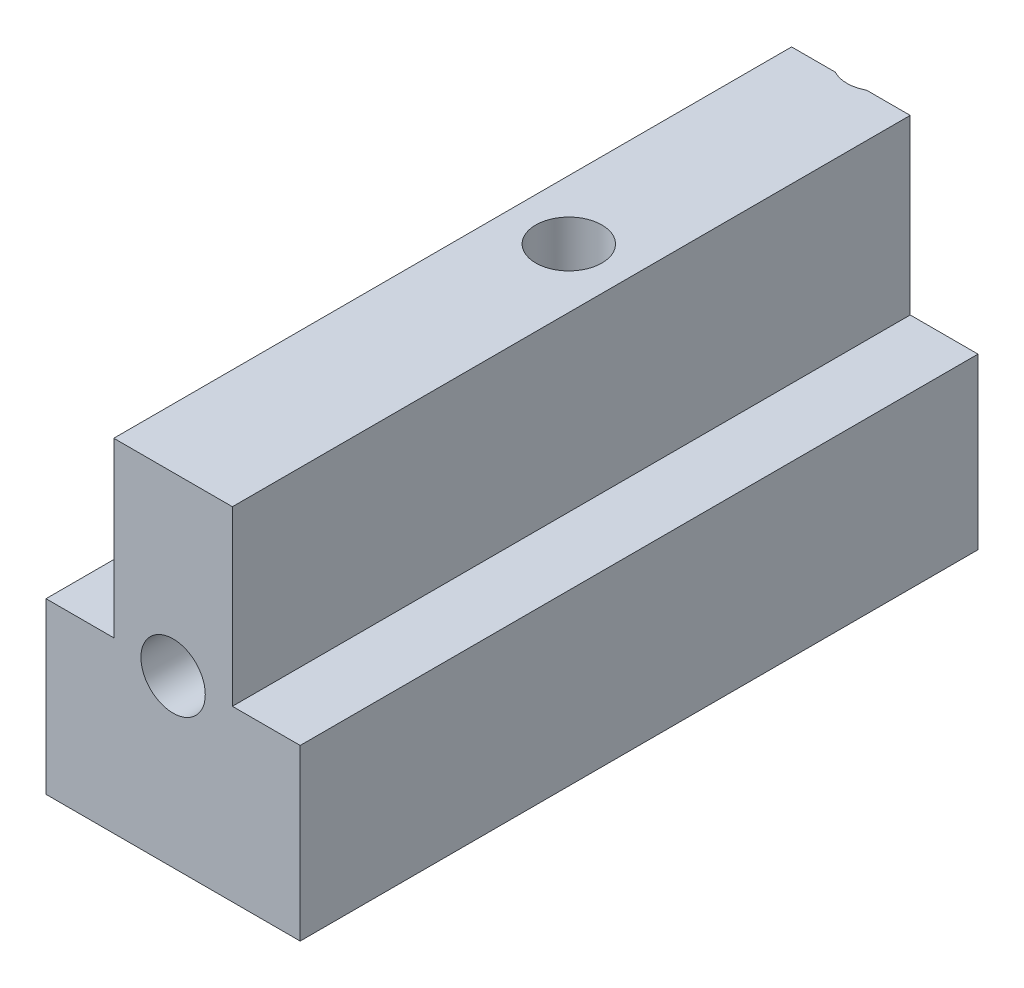
ISO-10303-21;
HEADER;
FILE_DESCRIPTION(('STEP AP214'),'2;1');
FILE_NAME('part.step','',(''),(''),'','','');
FILE_SCHEMA(('AUTOMOTIVE_DESIGN { 1 0 10303 214 1 1 1 1 }'));
ENDSEC;
DATA;
#1=APPLICATION_CONTEXT('core data for automotive mechanical design processes');
#2=APPLICATION_PROTOCOL_DEFINITION('international standard','automotive_design',2000,#1);
#3=PRODUCT_CONTEXT('',#1,'mechanical');
#4=PRODUCT('Part','Part','',(#3));
#5=PRODUCT_RELATED_PRODUCT_CATEGORY('part','',(#4));
#6=PRODUCT_DEFINITION_FORMATION('','',#4);
#7=PRODUCT_DEFINITION_CONTEXT('part definition',#1,'design');
#8=PRODUCT_DEFINITION('design','',#6,#7);
#9=PRODUCT_DEFINITION_SHAPE('','',#8);
#10=(LENGTH_UNIT() NAMED_UNIT(*) SI_UNIT(.MILLI.,.METRE.));
#11=(NAMED_UNIT(*) PLANE_ANGLE_UNIT() SI_UNIT($,.RADIAN.));
#12=(NAMED_UNIT(*) SI_UNIT($,.STERADIAN.) SOLID_ANGLE_UNIT());
#13=UNCERTAINTY_MEASURE_WITH_UNIT(LENGTH_MEASURE(1.E-05),#10,'distance_accuracy_value','');
#14=(GEOMETRIC_REPRESENTATION_CONTEXT(3) GLOBAL_UNCERTAINTY_ASSIGNED_CONTEXT((#13)) GLOBAL_UNIT_ASSIGNED_CONTEXT((#10,
#11,#12)) REPRESENTATION_CONTEXT('',''));
#15=CARTESIAN_POINT('',(0.,0.,0.));
#16=DIRECTION('',(0.,0.,1.));
#17=DIRECTION('',(1.,0.,0.));
#18=AXIS2_PLACEMENT_3D('',#15,#16,#17);
#19=CARTESIAN_POINT('',(0.,0.,0.));
#20=DIRECTION('',(0.,0.,-1.));
#21=DIRECTION('',(-1.,0.,0.));
#22=AXIS2_PLACEMENT_3D('',#19,#20,#21);
#23=PLANE('',#22);
#24=DIRECTION('',(0.,1.,0.));
#25=VECTOR('',#24,1.);
#26=CARTESIAN_POINT('',(0.210564790841906,-7.65729166666666,0.));
#27=LINE('',#26,#25);
#28=CARTESIAN_POINT('',(0.210564790841906,-7.65729166666666,0.));
#29=VERTEX_POINT('',#28);
#30=CARTESIAN_POINT('',(0.210564790841906,2.44270833333333,0.));
#31=VERTEX_POINT('',#30);
#32=EDGE_CURVE('E11',#29,#31,#27,.T.);
#33=ORIENTED_EDGE('',*,*,#32,.F.);
#34=DIRECTION('',(1.,0.,0.));
#35=VECTOR('',#34,1.);
#36=CARTESIAN_POINT('',(4.41993936567164,-7.65729166666666,0.));
#37=LINE('',#36,#35);
#38=CARTESIAN_POINT('',(-3.08006063432836,-7.65729166666666,0.));
#39=VERTEX_POINT('',#38);
#40=EDGE_CURVE('E150',#39,#29,#37,.T.);
#41=ORIENTED_EDGE('',*,*,#40,.F.);
#42=DIRECTION('',(0.,-1.,0.));
#43=VECTOR('',#42,1.);
#44=CARTESIAN_POINT('',(-3.08006063432836,-7.65729166666666,0.));
#45=LINE('',#44,#43);
#46=CARTESIAN_POINT('',(-3.08006063432836,-2.65729166666666,0.));
#47=VERTEX_POINT('',#46);
#48=EDGE_CURVE('E147',#47,#39,#45,.T.);
#49=ORIENTED_EDGE('',*,*,#48,.F.);
#50=DIRECTION('',(-1.,0.,0.));
#51=VECTOR('',#50,1.);
#52=CARTESIAN_POINT('',(-3.08006063432836,-2.65729166666666,0.));
#53=LINE('',#52,#51);
#54=CARTESIAN_POINT('',(-1.08006063432836,-2.65729166666666,0.));
#55=VERTEX_POINT('',#54);
#56=EDGE_CURVE('E144',#55,#47,#53,.T.);
#57=ORIENTED_EDGE('',*,*,#56,.F.);
#58=DIRECTION('',(0.,-1.,0.));
#59=VECTOR('',#58,1.);
#60=CARTESIAN_POINT('',(-1.08006063432836,-2.65729166666666,0.));
#61=LINE('',#60,#59);
#62=CARTESIAN_POINT('',(-1.08006063432836,2.44270833333333,0.));
#63=VERTEX_POINT('',#62);
#64=EDGE_CURVE('E141',#63,#55,#61,.T.);
#65=ORIENTED_EDGE('',*,*,#64,.F.);
#66=DIRECTION('',(-1.,0.,0.));
#67=VECTOR('',#66,1.);
#68=CARTESIAN_POINT('',(-1.08006063432836,2.44270833333333,0.));
#69=LINE('',#68,#67);
#70=EDGE_CURVE('E88',#31,#63,#69,.T.);
#71=ORIENTED_EDGE('',*,*,#70,.F.);
#72=EDGE_LOOP('',(#33,#41,#49,#57,#65,#71));
#73=FACE_BOUND('',#72,.T.);
#74=ADVANCED_FACE('F32',(#73),#23,.T.);
#75=CARTESIAN_POINT('',(-1.08006063432836,-2.65729166666666,20.));
#76=DIRECTION('',(1.,0.,0.));
#77=DIRECTION('',(0.,0.,-1.));
#78=AXIS2_PLACEMENT_3D('',#75,#76,#77);
#79=PLANE('',#78);
#80=ORIENTED_EDGE('',*,*,#64,.T.);
#81=DIRECTION('',(0.,0.,-1.));
#82=VECTOR('',#81,1.);
#83=CARTESIAN_POINT('',(-1.08006063432836,-2.65729166666666,20.));
#84=LINE('',#83,#82);
#85=CARTESIAN_POINT('',(-1.08006063432836,-2.65729166666666,20.));
#86=VERTEX_POINT('',#85);
#87=EDGE_CURVE('E174',#86,#55,#84,.T.);
#88=ORIENTED_EDGE('',*,*,#87,.F.);
#89=DIRECTION('',(0.,-1.,0.));
#90=VECTOR('',#89,1.);
#91=CARTESIAN_POINT('',(-1.08006063432836,-2.65729166666666,20.));
#92=LINE('',#91,#90);
#93=CARTESIAN_POINT('',(-1.08006063432836,2.44270833333333,20.));
#94=VERTEX_POINT('',#93);
#95=EDGE_CURVE('E161',#94,#86,#92,.T.);
#96=ORIENTED_EDGE('',*,*,#95,.F.);
#97=DIRECTION('',(0.,0.,-1.));
#98=VECTOR('',#97,1.);
#99=CARTESIAN_POINT('',(-1.08006063432836,2.44270833333333,20.));
#100=LINE('',#99,#98);
#101=EDGE_CURVE('E137',#94,#63,#100,.T.);
#102=ORIENTED_EDGE('',*,*,#101,.T.);
#103=EDGE_LOOP('',(#80,#88,#96,#102));
#104=FACE_BOUND('',#103,.T.);
#105=ADVANCED_FACE('F34',(#104),#79,.F.);
#106=CARTESIAN_POINT('',(-3.08006063432836,-2.65729166666666,20.));
#107=DIRECTION('',(0.,-1.,0.));
#108=DIRECTION('',(0.,0.,-1.));
#109=AXIS2_PLACEMENT_3D('',#106,#107,#108);
#110=PLANE('',#109);
#111=ORIENTED_EDGE('',*,*,#56,.T.);
#112=DIRECTION('',(0.,0.,-1.));
#113=VECTOR('',#112,1.);
#114=CARTESIAN_POINT('',(-3.08006063432836,-2.65729166666666,20.));
#115=LINE('',#114,#113);
#116=CARTESIAN_POINT('',(-3.08006063432836,-2.65729166666666,20.));
#117=VERTEX_POINT('',#116);
#118=EDGE_CURVE('E171',#117,#47,#115,.T.);
#119=ORIENTED_EDGE('',*,*,#118,.F.);
#120=DIRECTION('',(-1.,0.,0.));
#121=VECTOR('',#120,1.);
#122=CARTESIAN_POINT('',(-3.08006063432836,-2.65729166666666,20.));
#123=LINE('',#122,#121);
#124=EDGE_CURVE('E97',#86,#117,#123,.T.);
#125=ORIENTED_EDGE('',*,*,#124,.F.);
#126=ORIENTED_EDGE('',*,*,#87,.T.);
#127=EDGE_LOOP('',(#111,#119,#125,#126));
#128=FACE_BOUND('',#127,.T.);
#129=ADVANCED_FACE('F231',(#128),#110,.F.);
#130=CARTESIAN_POINT('',(-3.08006063432836,-7.65729166666666,20.));
#131=DIRECTION('',(1.,0.,0.));
#132=DIRECTION('',(0.,0.,-1.));
#133=AXIS2_PLACEMENT_3D('',#130,#131,#132);
#134=PLANE('',#133);
#135=ORIENTED_EDGE('',*,*,#48,.T.);
#136=DIRECTION('',(0.,0.,-1.));
#137=VECTOR('',#136,1.);
#138=CARTESIAN_POINT('',(-3.08006063432836,-7.65729166666666,20.));
#139=LINE('',#138,#137);
#140=CARTESIAN_POINT('',(-3.08006063432836,-7.65729166666666,20.));
#141=VERTEX_POINT('',#140);
#142=EDGE_CURVE('E168',#141,#39,#139,.T.);
#143=ORIENTED_EDGE('',*,*,#142,.F.);
#144=DIRECTION('',(0.,-1.,0.));
#145=VECTOR('',#144,1.);
#146=CARTESIAN_POINT('',(-3.08006063432836,-7.65729166666666,20.));
#147=LINE('',#146,#145);
#148=EDGE_CURVE('E200',#117,#141,#147,.T.);
#149=ORIENTED_EDGE('',*,*,#148,.F.);
#150=ORIENTED_EDGE('',*,*,#118,.T.);
#151=EDGE_LOOP('',(#135,#143,#149,#150));
#152=FACE_BOUND('',#151,.T.);
#153=ADVANCED_FACE('F234',(#152),#134,.F.);
#154=CARTESIAN_POINT('',(4.41993936567164,-7.65729166666666,20.));
#155=DIRECTION('',(0.,1.,0.));
#156=DIRECTION('',(-1.,0.,0.));
#157=AXIS2_PLACEMENT_3D('',#154,#155,#156);
#158=PLANE('',#157);
#159=CARTESIAN_POINT('',(0.66993936567164,-7.65729166666666,8.32292777632495));
#160=DIRECTION('',(0.,1.,0.));
#161=DIRECTION('',(0.,0.,1.));
#162=AXIS2_PLACEMENT_3D('',#159,#160,#161);
#163=CIRCLE('',#162,0.975);
#164=CARTESIAN_POINT('',(0.66993936567164,-7.65729166666666,9.29792777632495));
#165=VERTEX_POINT('',#164);
#166=EDGE_CURVE('E191',#165,#165,#163,.T.);
#167=ORIENTED_EDGE('',*,*,#166,.T.);
#168=EDGE_LOOP('',(#167));
#169=FACE_BOUND('',#168,.T.);
#170=ORIENTED_EDGE('',*,*,#40,.T.);
#171=CARTESIAN_POINT('',(0.669939365671643,-7.65729166666666,-0.859999999999999));
#172=DIRECTION('',(0.,1.,0.));
#173=DIRECTION('',(0.,0.,1.));
#174=AXIS2_PLACEMENT_3D('',#171,#172,#173);
#175=CIRCLE('',#174,0.975000000000001);
#176=CARTESIAN_POINT('',(1.12931394050138,-7.65729166666666,0.));
#177=VERTEX_POINT('',#176);
#178=EDGE_CURVE('E181',#29,#177,#175,.T.);
#179=ORIENTED_EDGE('',*,*,#178,.T.);
#180=CARTESIAN_POINT('',(4.41993936567164,-7.65729166666666,0.));
#181=VERTEX_POINT('',#180);
#182=EDGE_CURVE('E149',#177,#181,#37,.T.);
#183=ORIENTED_EDGE('',*,*,#182,.T.);
#184=DIRECTION('',(0.,0.,-1.));
#185=VECTOR('',#184,1.);
#186=CARTESIAN_POINT('',(4.41993936567164,-7.65729166666666,20.));
#187=LINE('',#186,#185);
#188=CARTESIAN_POINT('',(4.41993936567164,-7.65729166666666,20.));
#189=VERTEX_POINT('',#188);
#190=EDGE_CURVE('E165',#189,#181,#187,.T.);
#191=ORIENTED_EDGE('',*,*,#190,.F.);
#192=DIRECTION('',(1.,0.,0.));
#193=VECTOR('',#192,1.);
#194=CARTESIAN_POINT('',(4.41993936567164,-7.65729166666666,20.));
#195=LINE('',#194,#193);
#196=EDGE_CURVE('E198',#141,#189,#195,.T.);
#197=ORIENTED_EDGE('',*,*,#196,.F.);
#198=ORIENTED_EDGE('',*,*,#142,.T.);
#199=EDGE_LOOP('',(#170,#179,#183,#191,#197,#198));
#200=FACE_BOUND('',#199,.T.);
#201=ADVANCED_FACE('F188',(#169,#200),#158,.F.);
#202=CARTESIAN_POINT('',(4.41993936567164,-2.65729166666666,20.));
#203=DIRECTION('',(-1.,0.,0.));
#204=DIRECTION('',(0.,0.,1.));
#205=AXIS2_PLACEMENT_3D('',#202,#203,#204);
#206=PLANE('',#205);
#207=DIRECTION('',(0.,1.,0.));
#208=VECTOR('',#207,1.);
#209=CARTESIAN_POINT('',(4.41993936567164,-2.65729166666666,0.));
#210=LINE('',#209,#208);
#211=CARTESIAN_POINT('',(4.41993936567164,-2.65729166666666,0.));
#212=VERTEX_POINT('',#211);
#213=EDGE_CURVE('E153',#181,#212,#210,.T.);
#214=ORIENTED_EDGE('',*,*,#213,.T.);
#215=DIRECTION('',(0.,0.,-1.));
#216=VECTOR('',#215,1.);
#217=CARTESIAN_POINT('',(4.41993936567164,-2.65729166666666,20.));
#218=LINE('',#217,#216);
#219=CARTESIAN_POINT('',(4.41993936567164,-2.65729166666666,20.));
#220=VERTEX_POINT('',#219);
#221=EDGE_CURVE('E131',#220,#212,#218,.T.);
#222=ORIENTED_EDGE('',*,*,#221,.F.);
#223=DIRECTION('',(0.,1.,0.));
#224=VECTOR('',#223,1.);
#225=CARTESIAN_POINT('',(4.41993936567164,-2.65729166666666,20.));
#226=LINE('',#225,#224);
#227=EDGE_CURVE('E119',#189,#220,#226,.T.);
#228=ORIENTED_EDGE('',*,*,#227,.F.);
#229=ORIENTED_EDGE('',*,*,#190,.T.);
#230=EDGE_LOOP('',(#214,#222,#228,#229));
#231=FACE_BOUND('',#230,.T.);
#232=ADVANCED_FACE('F196',(#231),#206,.F.);
#233=CARTESIAN_POINT('',(2.41993936567164,-2.65729166666666,20.));
#234=DIRECTION('',(0.,-1.,0.));
#235=DIRECTION('',(0.,0.,-1.));
#236=AXIS2_PLACEMENT_3D('',#233,#234,#235);
#237=PLANE('',#236);
#238=DIRECTION('',(-1.,0.,0.));
#239=VECTOR('',#238,1.);
#240=CARTESIAN_POINT('',(2.41993936567164,-2.65729166666666,0.));
#241=LINE('',#240,#239);
#242=CARTESIAN_POINT('',(2.41993936567164,-2.65729166666666,0.));
#243=VERTEX_POINT('',#242);
#244=EDGE_CURVE('E128',#212,#243,#241,.T.);
#245=ORIENTED_EDGE('',*,*,#244,.T.);
#246=DIRECTION('',(0.,0.,-1.));
#247=VECTOR('',#246,1.);
#248=CARTESIAN_POINT('',(2.41993936567164,-2.65729166666666,20.));
#249=LINE('',#248,#247);
#250=CARTESIAN_POINT('',(2.41993936567164,-2.65729166666666,20.));
#251=VERTEX_POINT('',#250);
#252=EDGE_CURVE('E125',#251,#243,#249,.T.);
#253=ORIENTED_EDGE('',*,*,#252,.F.);
#254=DIRECTION('',(-1.,0.,0.));
#255=VECTOR('',#254,1.);
#256=CARTESIAN_POINT('',(2.41993936567164,-2.65729166666666,20.));
#257=LINE('',#256,#255);
#258=EDGE_CURVE('E112',#220,#251,#257,.T.);
#259=ORIENTED_EDGE('',*,*,#258,.F.);
#260=ORIENTED_EDGE('',*,*,#221,.T.);
#261=EDGE_LOOP('',(#245,#253,#259,#260));
#262=FACE_BOUND('',#261,.T.);
#263=ADVANCED_FACE('F126',(#262),#237,.F.);
#264=CARTESIAN_POINT('',(2.41993936567164,2.44270833333333,20.));
#265=DIRECTION('',(-1.,0.,0.));
#266=DIRECTION('',(0.,-1.,0.));
#267=AXIS2_PLACEMENT_3D('',#264,#265,#266);
#268=PLANE('',#267);
#269=DIRECTION('',(0.,1.,0.));
#270=VECTOR('',#269,1.);
#271=CARTESIAN_POINT('',(2.41993936567164,2.44270833333333,0.));
#272=LINE('',#271,#270);
#273=CARTESIAN_POINT('',(2.41993936567164,2.44270833333333,0.));
#274=VERTEX_POINT('',#273);
#275=EDGE_CURVE('E156',#243,#274,#272,.T.);
#276=ORIENTED_EDGE('',*,*,#275,.T.);
#277=DIRECTION('',(0.,0.,-1.));
#278=VECTOR('',#277,1.);
#279=CARTESIAN_POINT('',(2.41993936567164,2.44270833333333,20.));
#280=LINE('',#279,#278);
#281=CARTESIAN_POINT('',(2.41993936567164,2.44270833333333,20.));
#282=VERTEX_POINT('',#281);
#283=EDGE_CURVE('E132',#282,#274,#280,.T.);
#284=ORIENTED_EDGE('',*,*,#283,.F.);
#285=DIRECTION('',(0.,1.,0.));
#286=VECTOR('',#285,1.);
#287=CARTESIAN_POINT('',(2.41993936567164,2.44270833333333,20.));
#288=LINE('',#287,#286);
#289=EDGE_CURVE('E116',#251,#282,#288,.T.);
#290=ORIENTED_EDGE('',*,*,#289,.F.);
#291=ORIENTED_EDGE('',*,*,#252,.T.);
#292=EDGE_LOOP('',(#276,#284,#290,#291));
#293=FACE_BOUND('',#292,.T.);
#294=ADVANCED_FACE('F134',(#293),#268,.F.);
#295=CARTESIAN_POINT('',(-1.08006063432836,2.44270833333333,20.));
#296=DIRECTION('',(0.,-1.,0.));
#297=DIRECTION('',(0.,0.,-1.));
#298=AXIS2_PLACEMENT_3D('',#295,#296,#297);
#299=PLANE('',#298);
#300=CARTESIAN_POINT('',(0.66993936567164,2.44270833333333,8.32292777632495));
#301=DIRECTION('',(0.,-1.,0.));
#302=DIRECTION('',(0.,0.,-1.));
#303=AXIS2_PLACEMENT_3D('',#300,#301,#302);
#304=CIRCLE('',#303,0.975);
#305=CARTESIAN_POINT('',(0.66993936567164,2.44270833333333,7.34792777632495));
#306=VERTEX_POINT('',#305);
#307=EDGE_CURVE('E36',#306,#306,#304,.T.);
#308=ORIENTED_EDGE('',*,*,#307,.T.);
#309=EDGE_LOOP('',(#308));
#310=FACE_BOUND('',#309,.T.);
#311=CARTESIAN_POINT('',(1.12931394050138,2.44270833333333,0.));
#312=VERTEX_POINT('',#311);
#313=EDGE_CURVE('E158',#274,#312,#69,.T.);
#314=ORIENTED_EDGE('',*,*,#313,.T.);
#315=CARTESIAN_POINT('',(0.669939365671643,2.44270833333333,-0.859999999999999));
#316=DIRECTION('',(0.,-1.,0.));
#317=DIRECTION('',(0.,0.,-1.));
#318=AXIS2_PLACEMENT_3D('',#315,#316,#317);
#319=CIRCLE('',#318,0.975000000000001);
#320=EDGE_CURVE('E47',#312,#31,#319,.T.);
#321=ORIENTED_EDGE('',*,*,#320,.T.);
#322=ORIENTED_EDGE('',*,*,#70,.T.);
#323=ORIENTED_EDGE('',*,*,#101,.F.);
#324=DIRECTION('',(-1.,0.,0.));
#325=VECTOR('',#324,1.);
#326=CARTESIAN_POINT('',(-1.08006063432836,2.44270833333333,20.));
#327=LINE('',#326,#325);
#328=EDGE_CURVE('E56',#282,#94,#327,.T.);
#329=ORIENTED_EDGE('',*,*,#328,.F.);
#330=ORIENTED_EDGE('',*,*,#283,.T.);
#331=EDGE_LOOP('',(#314,#321,#322,#323,#329,#330));
#332=FACE_BOUND('',#331,.T.);
#333=ADVANCED_FACE('F223',(#310,#332),#299,.F.);
#334=CARTESIAN_POINT('',(0.,0.,20.));
#335=DIRECTION('',(0.,0.,-1.));
#336=DIRECTION('',(-1.,0.,0.));
#337=AXIS2_PLACEMENT_3D('',#334,#335,#336);
#338=PLANE('',#337);
#339=CARTESIAN_POINT('',(0.669939365671643,-2.75729166666666,20.));
#340=DIRECTION('',(0.,0.,1.));
#341=DIRECTION('',(1.,0.,0.));
#342=AXIS2_PLACEMENT_3D('',#339,#340,#341);
#343=CIRCLE('',#342,0.95);
#344=CARTESIAN_POINT('',(1.61993936567164,-2.75729166666666,20.));
#345=VERTEX_POINT('',#344);
#346=EDGE_CURVE('E206',#345,#345,#343,.T.);
#347=ORIENTED_EDGE('',*,*,#346,.F.);
#348=EDGE_LOOP('',(#347));
#349=FACE_BOUND('',#348,.T.);
#350=ORIENTED_EDGE('',*,*,#95,.T.);
#351=ORIENTED_EDGE('',*,*,#124,.T.);
#352=ORIENTED_EDGE('',*,*,#148,.T.);
#353=ORIENTED_EDGE('',*,*,#196,.T.);
#354=ORIENTED_EDGE('',*,*,#227,.T.);
#355=ORIENTED_EDGE('',*,*,#258,.T.);
#356=ORIENTED_EDGE('',*,*,#289,.T.);
#357=ORIENTED_EDGE('',*,*,#328,.T.);
#358=EDGE_LOOP('',(#350,#351,#352,#353,#354,#355,#356,#357));
#359=FACE_BOUND('',#358,.T.);
#360=ADVANCED_FACE('F114',(#349,#359),#338,.F.);
#361=DIRECTION('',(0.,1.,0.));
#362=VECTOR('',#361,1.);
#363=CARTESIAN_POINT('',(1.12931394050138,-7.65729166666666,0.));
#364=LINE('',#363,#362);
#365=EDGE_CURVE('E41',#312,#177,#364,.F.);
#366=ORIENTED_EDGE('',*,*,#365,.F.);
#367=ORIENTED_EDGE('',*,*,#313,.F.);
#368=ORIENTED_EDGE('',*,*,#275,.F.);
#369=ORIENTED_EDGE('',*,*,#244,.F.);
#370=ORIENTED_EDGE('',*,*,#213,.F.);
#371=ORIENTED_EDGE('',*,*,#182,.F.);
#372=EDGE_LOOP('',(#366,#367,#368,#369,#370,#371));
#373=FACE_BOUND('',#372,.T.);
#374=ADVANCED_FACE('F194',(#373),#23,.T.);
#375=CARTESIAN_POINT('',(0.669939365671643,-2.75729166666666,15.));
#376=DIRECTION('',(0.,0.,1.));
#377=DIRECTION('',(1.,0.,0.));
#378=AXIS2_PLACEMENT_3D('',#375,#376,#377);
#379=CYLINDRICAL_SURFACE('',#378,0.95);
#380=CARTESIAN_POINT('',(0.669939365671643,-2.75729166666666,15.));
#381=DIRECTION('',(0.,0.,1.));
#382=DIRECTION('',(1.,0.,0.));
#383=AXIS2_PLACEMENT_3D('',#380,#381,#382);
#384=CIRCLE('',#383,0.95);
#385=CARTESIAN_POINT('',(1.61993936567164,-2.75729166666666,15.));
#386=VERTEX_POINT('',#385);
#387=EDGE_CURVE('E145',#386,#386,#384,.T.);
#388=ORIENTED_EDGE('',*,*,#387,.F.);
#389=EDGE_LOOP('',(#388));
#390=FACE_BOUND('',#389,.T.);
#391=ORIENTED_EDGE('',*,*,#346,.T.);
#392=EDGE_LOOP('',(#391));
#393=FACE_BOUND('',#392,.T.);
#394=ADVANCED_FACE('F243',(#390,#393),#379,.F.);
#395=CARTESIAN_POINT('',(0.669939365671643,-2.75729166666666,15.));
#396=DIRECTION('',(0.,0.,1.));
#397=DIRECTION('',(1.,0.,0.));
#398=AXIS2_PLACEMENT_3D('',#395,#396,#397);
#399=PLANE('',#398);
#400=ORIENTED_EDGE('',*,*,#387,.T.);
#401=EDGE_LOOP('',(#400));
#402=FACE_BOUND('',#401,.T.);
#403=ADVANCED_FACE('F248',(#402),#399,.T.);
#404=CARTESIAN_POINT('',(0.669939365671643,-7.65729166666666,-0.859999999999999));
#405=DIRECTION('',(0.,1.,0.));
#406=DIRECTION('',(0.,0.,1.));
#407=AXIS2_PLACEMENT_3D('',#404,#405,#406);
#408=CYLINDRICAL_SURFACE('',#407,0.975000000000001);
#409=ORIENTED_EDGE('',*,*,#32,.T.);
#410=ORIENTED_EDGE('',*,*,#320,.F.);
#411=ORIENTED_EDGE('',*,*,#365,.T.);
#412=ORIENTED_EDGE('',*,*,#178,.F.);
#413=EDGE_LOOP('',(#409,#410,#411,#412));
#414=FACE_BOUND('',#413,.T.);
#415=ADVANCED_FACE('F179',(#414),#408,.F.);
#416=CARTESIAN_POINT('',(0.66993936567164,-7.65729166666666,8.32292777632495));
#417=DIRECTION('',(0.,1.,0.));
#418=DIRECTION('',(0.,0.,1.));
#419=AXIS2_PLACEMENT_3D('',#416,#417,#418);
#420=CYLINDRICAL_SURFACE('',#419,0.975);
#421=ORIENTED_EDGE('',*,*,#166,.F.);
#422=EDGE_LOOP('',(#421));
#423=FACE_BOUND('',#422,.T.);
#424=ORIENTED_EDGE('',*,*,#307,.F.);
#425=EDGE_LOOP('',(#424));
#426=FACE_BOUND('',#425,.T.);
#427=ADVANCED_FACE('F216',(#423,#426),#420,.F.);
#428=CLOSED_SHELL('',(#74,#105,#129,#153,#201,#232,#263,#294,#333,#360,#374,#394,#403,#415,#427));
#429=MANIFOLD_SOLID_BREP('B2',#428);
#430=ADVANCED_BREP_SHAPE_REPRESENTATION('',(#18,#429),#14);
#431=SHAPE_DEFINITION_REPRESENTATION(#9,#430);
ENDSEC;
END-ISO-10303-21;
